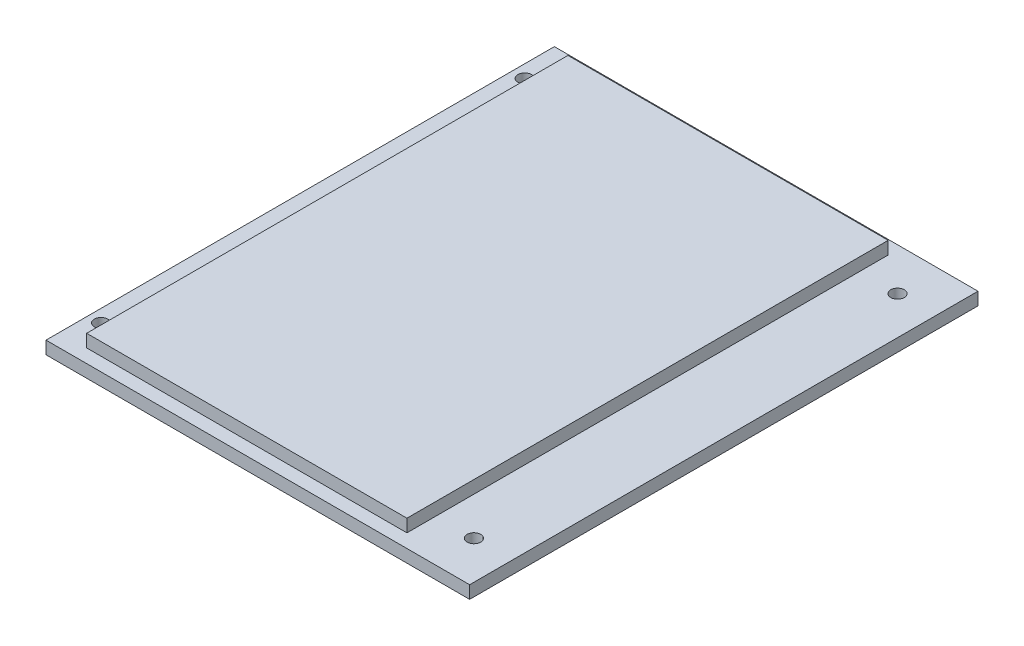
ISO-10303-21;
HEADER;
FILE_DESCRIPTION(('STEP AP214'),'2;1');
FILE_NAME('part.step','',(''),(''),'','','');
FILE_SCHEMA(('AUTOMOTIVE_DESIGN { 1 0 10303 214 1 1 1 1 }'));
ENDSEC;
DATA;
#1=APPLICATION_CONTEXT('core data for automotive mechanical design processes');
#2=APPLICATION_PROTOCOL_DEFINITION('international standard','automotive_design',2000,#1);
#3=PRODUCT_CONTEXT('',#1,'mechanical');
#4=PRODUCT('Part','Part','',(#3));
#5=PRODUCT_RELATED_PRODUCT_CATEGORY('part','',(#4));
#6=PRODUCT_DEFINITION_FORMATION('','',#4);
#7=PRODUCT_DEFINITION_CONTEXT('part definition',#1,'design');
#8=PRODUCT_DEFINITION('design','',#6,#7);
#9=PRODUCT_DEFINITION_SHAPE('','',#8);
#10=(LENGTH_UNIT() NAMED_UNIT(*) SI_UNIT(.MILLI.,.METRE.));
#11=(NAMED_UNIT(*) PLANE_ANGLE_UNIT() SI_UNIT($,.RADIAN.));
#12=(NAMED_UNIT(*) SI_UNIT($,.STERADIAN.) SOLID_ANGLE_UNIT());
#13=UNCERTAINTY_MEASURE_WITH_UNIT(LENGTH_MEASURE(1.E-05),#10,'distance_accuracy_value','');
#14=(GEOMETRIC_REPRESENTATION_CONTEXT(3) GLOBAL_UNCERTAINTY_ASSIGNED_CONTEXT((#13)) GLOBAL_UNIT_ASSIGNED_CONTEXT((#10,
#11,#12)) REPRESENTATION_CONTEXT('',''));
#15=CARTESIAN_POINT('',(0.,0.,0.));
#16=DIRECTION('',(0.,0.,1.));
#17=DIRECTION('',(1.,0.,0.));
#18=AXIS2_PLACEMENT_3D('',#15,#16,#17);
#19=CARTESIAN_POINT('',(0.,3.,0.));
#20=DIRECTION('',(0.,1.,0.));
#21=DIRECTION('',(0.,0.,1.));
#22=AXIS2_PLACEMENT_3D('',#19,#20,#21);
#23=PLANE('',#22);
#24=CARTESIAN_POINT('',(41.,3.,-50.));
#25=DIRECTION('',(0.,1.,0.));
#26=DIRECTION('',(0.,0.,1.));
#27=AXIS2_PLACEMENT_3D('',#24,#25,#26);
#28=CIRCLE('',#27,1.6);
#29=CARTESIAN_POINT('',(41.,3.,-48.4));
#30=VERTEX_POINT('',#29);
#31=EDGE_CURVE('E221',#30,#30,#28,.T.);
#32=ORIENTED_EDGE('',*,*,#31,.F.);
#33=EDGE_LOOP('',(#32));
#34=FACE_BOUND('',#33,.T.);
#35=CARTESIAN_POINT('',(-47.,3.,50.));
#36=DIRECTION('',(0.,1.,0.));
#37=DIRECTION('',(0.,0.,1.));
#38=AXIS2_PLACEMENT_3D('',#35,#36,#37);
#39=CIRCLE('',#38,1.6);
#40=CARTESIAN_POINT('',(-47.,3.,51.6));
#41=VERTEX_POINT('',#40);
#42=EDGE_CURVE('E227',#41,#41,#39,.T.);
#43=ORIENTED_EDGE('',*,*,#42,.F.);
#44=EDGE_LOOP('',(#43));
#45=FACE_BOUND('',#44,.T.);
#46=CARTESIAN_POINT('',(-47.,3.,-50.));
#47=DIRECTION('',(0.,1.,0.));
#48=DIRECTION('',(0.,0.,1.));
#49=AXIS2_PLACEMENT_3D('',#46,#47,#48);
#50=CIRCLE('',#49,1.6);
#51=CARTESIAN_POINT('',(-47.,3.,-48.4));
#52=VERTEX_POINT('',#51);
#53=EDGE_CURVE('E235',#52,#52,#50,.T.);
#54=ORIENTED_EDGE('',*,*,#53,.F.);
#55=EDGE_LOOP('',(#54));
#56=FACE_BOUND('',#55,.T.);
#57=CARTESIAN_POINT('',(41.,3.,50.));
#58=DIRECTION('',(0.,1.,0.));
#59=DIRECTION('',(0.,0.,1.));
#60=AXIS2_PLACEMENT_3D('',#57,#58,#59);
#61=CIRCLE('',#60,1.6);
#62=CARTESIAN_POINT('',(41.,3.,51.6));
#63=VERTEX_POINT('',#62);
#64=EDGE_CURVE('E224',#63,#63,#61,.T.);
#65=ORIENTED_EDGE('',*,*,#64,.F.);
#66=EDGE_LOOP('',(#65));
#67=FACE_BOUND('',#66,.T.);
#68=DIRECTION('',(0.,0.,1.));
#69=VECTOR('',#68,1.);
#70=CARTESIAN_POINT('',(-50.,3.,60.));
#71=LINE('',#70,#69);
#72=CARTESIAN_POINT('',(-50.,3.,-60.));
#73=VERTEX_POINT('',#72);
#74=CARTESIAN_POINT('',(-50.,3.,60.));
#75=VERTEX_POINT('',#74);
#76=EDGE_CURVE('E141',#73,#75,#71,.T.);
#77=ORIENTED_EDGE('',*,*,#76,.T.);
#78=DIRECTION('',(1.,0.,0.));
#79=VECTOR('',#78,1.);
#80=CARTESIAN_POINT('',(50.,3.,60.));
#81=LINE('',#80,#79);
#82=CARTESIAN_POINT('',(50.,3.,60.));
#83=VERTEX_POINT('',#82);
#84=EDGE_CURVE('E86',#75,#83,#81,.T.);
#85=ORIENTED_EDGE('',*,*,#84,.T.);
#86=DIRECTION('',(0.,0.,-1.));
#87=VECTOR('',#86,1.);
#88=CARTESIAN_POINT('',(50.,3.,60.));
#89=LINE('',#88,#87);
#90=CARTESIAN_POINT('',(50.,3.,-60.));
#91=VERTEX_POINT('',#90);
#92=EDGE_CURVE('E144',#83,#91,#89,.T.);
#93=ORIENTED_EDGE('',*,*,#92,.T.);
#94=DIRECTION('',(-1.,0.,0.));
#95=VECTOR('',#94,1.);
#96=CARTESIAN_POINT('',(50.,3.,-60.));
#97=LINE('',#96,#95);
#98=EDGE_CURVE('E58',#91,#73,#97,.T.);
#99=ORIENTED_EDGE('',*,*,#98,.T.);
#100=EDGE_LOOP('',(#77,#85,#93,#99));
#101=FACE_BOUND('',#100,.T.);
#102=DIRECTION('',(1.,0.,0.));
#103=VECTOR('',#102,1.);
#104=CARTESIAN_POINT('',(32.,3.,56.8));
#105=LINE('',#104,#103);
#106=CARTESIAN_POINT('',(-43.6,3.,56.8));
#107=VERTEX_POINT('',#106);
#108=CARTESIAN_POINT('',(32.,3.,56.8));
#109=VERTEX_POINT('',#108);
#110=EDGE_CURVE('E247',#107,#109,#105,.T.);
#111=ORIENTED_EDGE('',*,*,#110,.F.);
#112=DIRECTION('',(0.,0.,1.));
#113=VECTOR('',#112,1.);
#114=CARTESIAN_POINT('',(-43.6,3.,56.8));
#115=LINE('',#114,#113);
#116=CARTESIAN_POINT('',(-43.6,3.,-56.8));
#117=VERTEX_POINT('',#116);
#118=EDGE_CURVE('E131',#117,#107,#115,.T.);
#119=ORIENTED_EDGE('',*,*,#118,.F.);
#120=DIRECTION('',(-1.,0.,0.));
#121=VECTOR('',#120,1.);
#122=CARTESIAN_POINT('',(32.,3.,-56.8));
#123=LINE('',#122,#121);
#124=CARTESIAN_POINT('',(32.,3.,-56.8));
#125=VERTEX_POINT('',#124);
#126=EDGE_CURVE('E127',#125,#117,#123,.T.);
#127=ORIENTED_EDGE('',*,*,#126,.F.);
#128=DIRECTION('',(0.,0.,-1.));
#129=VECTOR('',#128,1.);
#130=CARTESIAN_POINT('',(32.,3.,56.8));
#131=LINE('',#130,#129);
#132=EDGE_CURVE('E249',#109,#125,#131,.T.);
#133=ORIENTED_EDGE('',*,*,#132,.F.);
#134=EDGE_LOOP('',(#111,#119,#127,#133));
#135=FACE_BOUND('',#134,.T.);
#136=ADVANCED_FACE('F34',(#34,#45,#56,#67,#101,#135),#23,.T.);
#137=CARTESIAN_POINT('',(-50.,3.,60.));
#138=DIRECTION('',(1.,0.,0.));
#139=DIRECTION('',(0.,0.,-1.));
#140=AXIS2_PLACEMENT_3D('',#137,#138,#139);
#141=PLANE('',#140);
#142=DIRECTION('',(0.,0.,1.));
#143=VECTOR('',#142,1.);
#144=CARTESIAN_POINT('',(-50.,0.,60.));
#145=LINE('',#144,#143);
#146=CARTESIAN_POINT('',(-50.,0.,-60.));
#147=VERTEX_POINT('',#146);
#148=CARTESIAN_POINT('',(-50.,0.,60.));
#149=VERTEX_POINT('',#148);
#150=EDGE_CURVE('E133',#147,#149,#145,.T.);
#151=ORIENTED_EDGE('',*,*,#150,.T.);
#152=DIRECTION('',(0.,-1.,0.));
#153=VECTOR('',#152,1.);
#154=CARTESIAN_POINT('',(-50.,3.,60.));
#155=LINE('',#154,#153);
#156=EDGE_CURVE('E11',#75,#149,#155,.T.);
#157=ORIENTED_EDGE('',*,*,#156,.F.);
#158=ORIENTED_EDGE('',*,*,#76,.F.);
#159=DIRECTION('',(0.,-1.,0.));
#160=VECTOR('',#159,1.);
#161=CARTESIAN_POINT('',(-50.,3.,-60.));
#162=LINE('',#161,#160);
#163=EDGE_CURVE('E146',#73,#147,#162,.T.);
#164=ORIENTED_EDGE('',*,*,#163,.T.);
#165=EDGE_LOOP('',(#151,#157,#158,#164));
#166=FACE_BOUND('',#165,.T.);
#167=ADVANCED_FACE('F36',(#166),#141,.F.);
#168=CARTESIAN_POINT('',(50.,3.,60.));
#169=DIRECTION('',(0.,0.,-1.));
#170=DIRECTION('',(-1.,0.,0.));
#171=AXIS2_PLACEMENT_3D('',#168,#169,#170);
#172=PLANE('',#171);
#173=DIRECTION('',(1.,0.,0.));
#174=VECTOR('',#173,1.);
#175=CARTESIAN_POINT('',(50.,0.,60.));
#176=LINE('',#175,#174);
#177=CARTESIAN_POINT('',(50.,0.,60.));
#178=VERTEX_POINT('',#177);
#179=EDGE_CURVE('E136',#149,#178,#176,.T.);
#180=ORIENTED_EDGE('',*,*,#179,.T.);
#181=DIRECTION('',(0.,-1.,0.));
#182=VECTOR('',#181,1.);
#183=CARTESIAN_POINT('',(50.,3.,60.));
#184=LINE('',#183,#182);
#185=EDGE_CURVE('E42',#83,#178,#184,.T.);
#186=ORIENTED_EDGE('',*,*,#185,.F.);
#187=ORIENTED_EDGE('',*,*,#84,.F.);
#188=ORIENTED_EDGE('',*,*,#156,.T.);
#189=EDGE_LOOP('',(#180,#186,#187,#188));
#190=FACE_BOUND('',#189,.T.);
#191=ADVANCED_FACE('F175',(#190),#172,.F.);
#192=CARTESIAN_POINT('',(50.,3.,60.));
#193=DIRECTION('',(-1.,0.,0.));
#194=DIRECTION('',(0.,0.,1.));
#195=AXIS2_PLACEMENT_3D('',#192,#193,#194);
#196=PLANE('',#195);
#197=DIRECTION('',(0.,0.,-1.));
#198=VECTOR('',#197,1.);
#199=CARTESIAN_POINT('',(50.,0.,60.));
#200=LINE('',#199,#198);
#201=CARTESIAN_POINT('',(50.,0.,-60.));
#202=VERTEX_POINT('',#201);
#203=EDGE_CURVE('E149',#178,#202,#200,.T.);
#204=ORIENTED_EDGE('',*,*,#203,.T.);
#205=DIRECTION('',(0.,-1.,0.));
#206=VECTOR('',#205,1.);
#207=CARTESIAN_POINT('',(50.,3.,-60.));
#208=LINE('',#207,#206);
#209=EDGE_CURVE('E153',#91,#202,#208,.T.);
#210=ORIENTED_EDGE('',*,*,#209,.F.);
#211=ORIENTED_EDGE('',*,*,#92,.F.);
#212=ORIENTED_EDGE('',*,*,#185,.T.);
#213=EDGE_LOOP('',(#204,#210,#211,#212));
#214=FACE_BOUND('',#213,.T.);
#215=ADVANCED_FACE('F158',(#214),#196,.F.);
#216=CARTESIAN_POINT('',(50.,3.,-60.));
#217=DIRECTION('',(0.,0.,1.));
#218=DIRECTION('',(1.,0.,0.));
#219=AXIS2_PLACEMENT_3D('',#216,#217,#218);
#220=PLANE('',#219);
#221=DIRECTION('',(-1.,0.,0.));
#222=VECTOR('',#221,1.);
#223=CARTESIAN_POINT('',(50.,0.,-60.));
#224=LINE('',#223,#222);
#225=EDGE_CURVE('E79',#202,#147,#224,.T.);
#226=ORIENTED_EDGE('',*,*,#225,.T.);
#227=ORIENTED_EDGE('',*,*,#163,.F.);
#228=ORIENTED_EDGE('',*,*,#98,.F.);
#229=ORIENTED_EDGE('',*,*,#209,.T.);
#230=EDGE_LOOP('',(#226,#227,#228,#229));
#231=FACE_BOUND('',#230,.T.);
#232=ADVANCED_FACE('F166',(#231),#220,.F.);
#233=CARTESIAN_POINT('',(0.,0.,0.));
#234=DIRECTION('',(0.,1.,0.));
#235=DIRECTION('',(0.,0.,1.));
#236=AXIS2_PLACEMENT_3D('',#233,#234,#235);
#237=PLANE('',#236);
#238=CARTESIAN_POINT('',(41.,0.,-50.));
#239=DIRECTION('',(0.,1.,0.));
#240=DIRECTION('',(0.,0.,1.));
#241=AXIS2_PLACEMENT_3D('',#238,#239,#240);
#242=CIRCLE('',#241,1.6);
#243=CARTESIAN_POINT('',(41.,0.,-48.4));
#244=VERTEX_POINT('',#243);
#245=EDGE_CURVE('E219',#244,#244,#242,.T.);
#246=ORIENTED_EDGE('',*,*,#245,.T.);
#247=EDGE_LOOP('',(#246));
#248=FACE_BOUND('',#247,.T.);
#249=CARTESIAN_POINT('',(-47.,0.,50.));
#250=DIRECTION('',(0.,1.,0.));
#251=DIRECTION('',(0.,0.,1.));
#252=AXIS2_PLACEMENT_3D('',#249,#250,#251);
#253=CIRCLE('',#252,1.6);
#254=CARTESIAN_POINT('',(-47.,0.,51.6));
#255=VERTEX_POINT('',#254);
#256=EDGE_CURVE('E222',#255,#255,#253,.T.);
#257=ORIENTED_EDGE('',*,*,#256,.T.);
#258=EDGE_LOOP('',(#257));
#259=FACE_BOUND('',#258,.T.);
#260=CARTESIAN_POINT('',(-47.,0.,-50.));
#261=DIRECTION('',(0.,1.,0.));
#262=DIRECTION('',(0.,0.,1.));
#263=AXIS2_PLACEMENT_3D('',#260,#261,#262);
#264=CIRCLE('',#263,1.6);
#265=CARTESIAN_POINT('',(-47.,0.,-48.4));
#266=VERTEX_POINT('',#265);
#267=EDGE_CURVE('E232',#266,#266,#264,.T.);
#268=ORIENTED_EDGE('',*,*,#267,.T.);
#269=EDGE_LOOP('',(#268));
#270=FACE_BOUND('',#269,.T.);
#271=CARTESIAN_POINT('',(41.,0.,50.));
#272=DIRECTION('',(0.,1.,0.));
#273=DIRECTION('',(0.,0.,1.));
#274=AXIS2_PLACEMENT_3D('',#271,#272,#273);
#275=CIRCLE('',#274,1.6);
#276=CARTESIAN_POINT('',(41.,0.,51.6));
#277=VERTEX_POINT('',#276);
#278=EDGE_CURVE('E238',#277,#277,#275,.T.);
#279=ORIENTED_EDGE('',*,*,#278,.T.);
#280=EDGE_LOOP('',(#279));
#281=FACE_BOUND('',#280,.T.);
#282=ORIENTED_EDGE('',*,*,#150,.F.);
#283=ORIENTED_EDGE('',*,*,#225,.F.);
#284=ORIENTED_EDGE('',*,*,#203,.F.);
#285=ORIENTED_EDGE('',*,*,#179,.F.);
#286=EDGE_LOOP('',(#282,#283,#284,#285));
#287=FACE_BOUND('',#286,.T.);
#288=ADVANCED_FACE('F162',(#248,#259,#270,#281,#287),#237,.F.);
#289=CARTESIAN_POINT('',(-43.6,6.,56.8));
#290=DIRECTION('',(1.,0.,0.));
#291=DIRECTION('',(0.,0.,-1.));
#292=AXIS2_PLACEMENT_3D('',#289,#290,#291);
#293=PLANE('',#292);
#294=ORIENTED_EDGE('',*,*,#118,.T.);
#295=DIRECTION('',(0.,-1.,0.));
#296=VECTOR('',#295,1.);
#297=CARTESIAN_POINT('',(-43.6,6.,56.8));
#298=LINE('',#297,#296);
#299=CARTESIAN_POINT('',(-43.6,6.,56.8));
#300=VERTEX_POINT('',#299);
#301=EDGE_CURVE('E112',#300,#107,#298,.T.);
#302=ORIENTED_EDGE('',*,*,#301,.F.);
#303=DIRECTION('',(0.,0.,1.));
#304=VECTOR('',#303,1.);
#305=CARTESIAN_POINT('',(-43.6,6.,56.8));
#306=LINE('',#305,#304);
#307=CARTESIAN_POINT('',(-43.6,6.,-56.8));
#308=VERTEX_POINT('',#307);
#309=EDGE_CURVE('E119',#308,#300,#306,.T.);
#310=ORIENTED_EDGE('',*,*,#309,.F.);
#311=DIRECTION('',(0.,-1.,0.));
#312=VECTOR('',#311,1.);
#313=CARTESIAN_POINT('',(-43.6,6.,-56.8));
#314=LINE('',#313,#312);
#315=EDGE_CURVE('E245',#308,#117,#314,.T.);
#316=ORIENTED_EDGE('',*,*,#315,.T.);
#317=EDGE_LOOP('',(#294,#302,#310,#316));
#318=FACE_BOUND('',#317,.T.);
#319=ADVANCED_FACE('F129',(#318),#293,.F.);
#320=CARTESIAN_POINT('',(32.,6.,56.8));
#321=DIRECTION('',(0.,0.,-1.));
#322=DIRECTION('',(-1.,0.,0.));
#323=AXIS2_PLACEMENT_3D('',#320,#321,#322);
#324=PLANE('',#323);
#325=ORIENTED_EDGE('',*,*,#110,.T.);
#326=DIRECTION('',(0.,-1.,0.));
#327=VECTOR('',#326,1.);
#328=CARTESIAN_POINT('',(32.,6.,56.8));
#329=LINE('',#328,#327);
#330=CARTESIAN_POINT('',(32.,6.,56.8));
#331=VERTEX_POINT('',#330);
#332=EDGE_CURVE('E115',#331,#109,#329,.T.);
#333=ORIENTED_EDGE('',*,*,#332,.F.);
#334=DIRECTION('',(1.,0.,0.));
#335=VECTOR('',#334,1.);
#336=CARTESIAN_POINT('',(32.,6.,56.8));
#337=LINE('',#336,#335);
#338=EDGE_CURVE('E108',#300,#331,#337,.T.);
#339=ORIENTED_EDGE('',*,*,#338,.F.);
#340=ORIENTED_EDGE('',*,*,#301,.T.);
#341=EDGE_LOOP('',(#325,#333,#339,#340));
#342=FACE_BOUND('',#341,.T.);
#343=ADVANCED_FACE('F110',(#342),#324,.F.);
#344=CARTESIAN_POINT('',(32.,6.,56.8));
#345=DIRECTION('',(-1.,0.,0.));
#346=DIRECTION('',(0.,0.,1.));
#347=AXIS2_PLACEMENT_3D('',#344,#345,#346);
#348=PLANE('',#347);
#349=ORIENTED_EDGE('',*,*,#132,.T.);
#350=DIRECTION('',(0.,-1.,0.));
#351=VECTOR('',#350,1.);
#352=CARTESIAN_POINT('',(32.,6.,-56.8));
#353=LINE('',#352,#351);
#354=CARTESIAN_POINT('',(32.,6.,-56.8));
#355=VERTEX_POINT('',#354);
#356=EDGE_CURVE('E49',#355,#125,#353,.T.);
#357=ORIENTED_EDGE('',*,*,#356,.F.);
#358=DIRECTION('',(0.,0.,-1.));
#359=VECTOR('',#358,1.);
#360=CARTESIAN_POINT('',(32.,6.,56.8));
#361=LINE('',#360,#359);
#362=EDGE_CURVE('E118',#331,#355,#361,.T.);
#363=ORIENTED_EDGE('',*,*,#362,.F.);
#364=ORIENTED_EDGE('',*,*,#332,.T.);
#365=EDGE_LOOP('',(#349,#357,#363,#364));
#366=FACE_BOUND('',#365,.T.);
#367=ADVANCED_FACE('F190',(#366),#348,.F.);
#368=CARTESIAN_POINT('',(32.,6.,-56.8));
#369=DIRECTION('',(0.,0.,1.));
#370=DIRECTION('',(1.,0.,0.));
#371=AXIS2_PLACEMENT_3D('',#368,#369,#370);
#372=PLANE('',#371);
#373=ORIENTED_EDGE('',*,*,#126,.T.);
#374=ORIENTED_EDGE('',*,*,#315,.F.);
#375=DIRECTION('',(-1.,0.,0.));
#376=VECTOR('',#375,1.);
#377=CARTESIAN_POINT('',(32.,6.,-56.8));
#378=LINE('',#377,#376);
#379=EDGE_CURVE('E123',#355,#308,#378,.T.);
#380=ORIENTED_EDGE('',*,*,#379,.F.);
#381=ORIENTED_EDGE('',*,*,#356,.T.);
#382=EDGE_LOOP('',(#373,#374,#380,#381));
#383=FACE_BOUND('',#382,.T.);
#384=ADVANCED_FACE('F193',(#383),#372,.F.);
#385=CARTESIAN_POINT('',(0.,6.,0.));
#386=DIRECTION('',(0.,1.,0.));
#387=DIRECTION('',(0.,0.,1.));
#388=AXIS2_PLACEMENT_3D('',#385,#386,#387);
#389=PLANE('',#388);
#390=ORIENTED_EDGE('',*,*,#309,.T.);
#391=ORIENTED_EDGE('',*,*,#338,.T.);
#392=ORIENTED_EDGE('',*,*,#362,.T.);
#393=ORIENTED_EDGE('',*,*,#379,.T.);
#394=EDGE_LOOP('',(#390,#391,#392,#393));
#395=FACE_BOUND('',#394,.T.);
#396=ADVANCED_FACE('F122',(#395),#389,.T.);
#397=CARTESIAN_POINT('',(41.,0.,50.));
#398=DIRECTION('',(0.,1.,0.));
#399=DIRECTION('',(0.,0.,1.));
#400=AXIS2_PLACEMENT_3D('',#397,#398,#399);
#401=CYLINDRICAL_SURFACE('',#400,1.6);
#402=ORIENTED_EDGE('',*,*,#278,.F.);
#403=EDGE_LOOP('',(#402));
#404=FACE_BOUND('',#403,.T.);
#405=ORIENTED_EDGE('',*,*,#64,.T.);
#406=EDGE_LOOP('',(#405));
#407=FACE_BOUND('',#406,.T.);
#408=ADVANCED_FACE('F199',(#404,#407),#401,.F.);
#409=CARTESIAN_POINT('',(-47.,0.,-50.));
#410=DIRECTION('',(0.,1.,0.));
#411=DIRECTION('',(0.,0.,1.));
#412=AXIS2_PLACEMENT_3D('',#409,#410,#411);
#413=CYLINDRICAL_SURFACE('',#412,1.6);
#414=ORIENTED_EDGE('',*,*,#267,.F.);
#415=EDGE_LOOP('',(#414));
#416=FACE_BOUND('',#415,.T.);
#417=ORIENTED_EDGE('',*,*,#53,.T.);
#418=EDGE_LOOP('',(#417));
#419=FACE_BOUND('',#418,.T.);
#420=ADVANCED_FACE('F202',(#416,#419),#413,.F.);
#421=CARTESIAN_POINT('',(-47.,0.,50.));
#422=DIRECTION('',(0.,1.,0.));
#423=DIRECTION('',(0.,0.,1.));
#424=AXIS2_PLACEMENT_3D('',#421,#422,#423);
#425=CYLINDRICAL_SURFACE('',#424,1.6);
#426=ORIENTED_EDGE('',*,*,#256,.F.);
#427=EDGE_LOOP('',(#426));
#428=FACE_BOUND('',#427,.T.);
#429=ORIENTED_EDGE('',*,*,#42,.T.);
#430=EDGE_LOOP('',(#429));
#431=FACE_BOUND('',#430,.T.);
#432=ADVANCED_FACE('F206',(#428,#431),#425,.F.);
#433=CARTESIAN_POINT('',(41.,0.,-50.));
#434=DIRECTION('',(0.,1.,0.));
#435=DIRECTION('',(0.,0.,1.));
#436=AXIS2_PLACEMENT_3D('',#433,#434,#435);
#437=CYLINDRICAL_SURFACE('',#436,1.6);
#438=ORIENTED_EDGE('',*,*,#245,.F.);
#439=EDGE_LOOP('',(#438));
#440=FACE_BOUND('',#439,.T.);
#441=ORIENTED_EDGE('',*,*,#31,.T.);
#442=EDGE_LOOP('',(#441));
#443=FACE_BOUND('',#442,.T.);
#444=ADVANCED_FACE('F210',(#440,#443),#437,.F.);
#445=CLOSED_SHELL('',(#136,#167,#191,#215,#232,#288,#319,#343,#367,#384,#396,#408,#420,#432,#444));
#446=MANIFOLD_SOLID_BREP('B2',#445);
#447=ADVANCED_BREP_SHAPE_REPRESENTATION('',(#18,#446),#14);
#448=SHAPE_DEFINITION_REPRESENTATION(#9,#447);
ENDSEC;
END-ISO-10303-21;
